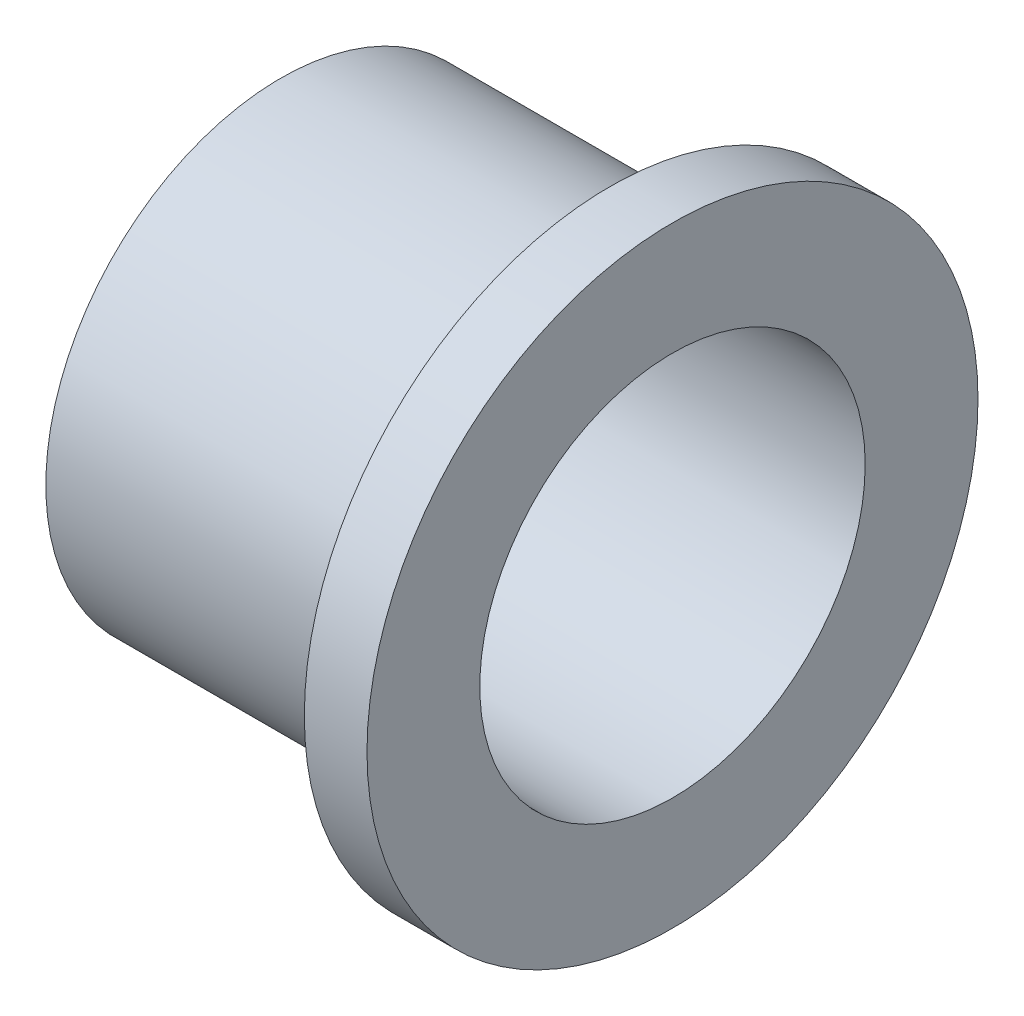
ISO-10303-21;
HEADER;
FILE_DESCRIPTION(('STEP AP214'),'2;1');
FILE_NAME('part.step','',(''),(''),'','','');
FILE_SCHEMA(('AUTOMOTIVE_DESIGN { 1 0 10303 214 1 1 1 1 }'));
ENDSEC;
DATA;
#1=APPLICATION_CONTEXT('core data for automotive mechanical design processes');
#2=APPLICATION_PROTOCOL_DEFINITION('international standard','automotive_design',2000,#1);
#3=PRODUCT_CONTEXT('',#1,'mechanical');
#4=PRODUCT('Part','Part','',(#3));
#5=PRODUCT_RELATED_PRODUCT_CATEGORY('part','',(#4));
#6=PRODUCT_DEFINITION_FORMATION('','',#4);
#7=PRODUCT_DEFINITION_CONTEXT('part definition',#1,'design');
#8=PRODUCT_DEFINITION('design','',#6,#7);
#9=PRODUCT_DEFINITION_SHAPE('','',#8);
#10=(LENGTH_UNIT() NAMED_UNIT(*) SI_UNIT(.MILLI.,.METRE.));
#11=(NAMED_UNIT(*) PLANE_ANGLE_UNIT() SI_UNIT($,.RADIAN.));
#12=(NAMED_UNIT(*) SI_UNIT($,.STERADIAN.) SOLID_ANGLE_UNIT());
#13=UNCERTAINTY_MEASURE_WITH_UNIT(LENGTH_MEASURE(1.E-05),#10,'distance_accuracy_value','');
#14=(GEOMETRIC_REPRESENTATION_CONTEXT(3) GLOBAL_UNCERTAINTY_ASSIGNED_CONTEXT((#13)) GLOBAL_UNIT_ASSIGNED_CONTEXT((#10,
#11,#12)) REPRESENTATION_CONTEXT('',''));
#15=CARTESIAN_POINT('',(0.,0.,0.));
#16=DIRECTION('',(0.,0.,1.));
#17=DIRECTION('',(1.,0.,0.));
#18=AXIS2_PLACEMENT_3D('',#15,#16,#17);
#19=CARTESIAN_POINT('',(5.,0.,0.));
#20=DIRECTION('',(-1.,0.,0.));
#21=DIRECTION('',(0.,0.,1.));
#22=AXIS2_PLACEMENT_3D('',#19,#20,#21);
#23=CYLINDRICAL_SURFACE('',#22,3.);
#24=CARTESIAN_POINT('',(0.,0.,0.));
#25=DIRECTION('',(1.,0.,0.));
#26=DIRECTION('',(0.,0.,-1.));
#27=AXIS2_PLACEMENT_3D('',#24,#25,#26);
#28=CIRCLE('',#27,3.);
#29=CARTESIAN_POINT('',(0.,0.,-3.));
#30=VERTEX_POINT('',#29);
#31=EDGE_CURVE('E33',#30,#30,#28,.T.);
#32=ORIENTED_EDGE('',*,*,#31,.T.);
#33=EDGE_LOOP('',(#32));
#34=FACE_BOUND('',#33,.T.);
#35=CARTESIAN_POINT('',(4.2,0.,0.));
#36=DIRECTION('',(1.,0.,0.));
#37=DIRECTION('',(0.,0.,-1.));
#38=AXIS2_PLACEMENT_3D('',#35,#36,#37);
#39=CIRCLE('',#38,3.);
#40=CARTESIAN_POINT('',(4.2,0.,-3.));
#41=VERTEX_POINT('',#40);
#42=EDGE_CURVE('E10',#41,#41,#39,.T.);
#43=ORIENTED_EDGE('',*,*,#42,.F.);
#44=EDGE_LOOP('',(#43));
#45=FACE_BOUND('',#44,.T.);
#46=ADVANCED_FACE('F30',(#34,#45),#23,.T.);
#47=CARTESIAN_POINT('',(5.,0.,0.));
#48=DIRECTION('',(1.,0.,0.));
#49=DIRECTION('',(0.,0.,-1.));
#50=AXIS2_PLACEMENT_3D('',#47,#48,#49);
#51=PLANE('',#50);
#52=CARTESIAN_POINT('',(5.,0.,0.));
#53=DIRECTION('',(1.,0.,0.));
#54=DIRECTION('',(0.,0.,-1.));
#55=AXIS2_PLACEMENT_3D('',#52,#53,#54);
#56=CIRCLE('',#55,2.46);
#57=CARTESIAN_POINT('',(5.,0.,-2.46));
#58=VERTEX_POINT('',#57);
#59=EDGE_CURVE('E41',#58,#58,#56,.T.);
#60=ORIENTED_EDGE('',*,*,#59,.F.);
#61=EDGE_LOOP('',(#60));
#62=FACE_BOUND('',#61,.T.);
#63=CARTESIAN_POINT('',(5.,0.,0.));
#64=DIRECTION('',(1.,0.,0.));
#65=DIRECTION('',(0.,0.,-1.));
#66=AXIS2_PLACEMENT_3D('',#63,#64,#65);
#67=CIRCLE('',#66,3.9);
#68=CARTESIAN_POINT('',(5.,0.,-3.9));
#69=VERTEX_POINT('',#68);
#70=EDGE_CURVE('E44',#69,#69,#67,.T.);
#71=ORIENTED_EDGE('',*,*,#70,.T.);
#72=EDGE_LOOP('',(#71));
#73=FACE_BOUND('',#72,.T.);
#74=ADVANCED_FACE('F58',(#62,#73),#51,.T.);
#75=CARTESIAN_POINT('',(0.,0.,0.));
#76=DIRECTION('',(1.,0.,0.));
#77=DIRECTION('',(0.,0.,-1.));
#78=AXIS2_PLACEMENT_3D('',#75,#76,#77);
#79=PLANE('',#78);
#80=ORIENTED_EDGE('',*,*,#31,.F.);
#81=EDGE_LOOP('',(#80));
#82=FACE_BOUND('',#81,.T.);
#83=CARTESIAN_POINT('',(0.,0.,0.));
#84=DIRECTION('',(1.,0.,0.));
#85=DIRECTION('',(0.,0.,-1.));
#86=AXIS2_PLACEMENT_3D('',#83,#84,#85);
#87=CIRCLE('',#86,2.46);
#88=CARTESIAN_POINT('',(0.,0.,-2.46));
#89=VERTEX_POINT('',#88);
#90=EDGE_CURVE('E47',#89,#89,#87,.T.);
#91=ORIENTED_EDGE('',*,*,#90,.T.);
#92=EDGE_LOOP('',(#91));
#93=FACE_BOUND('',#92,.T.);
#94=ADVANCED_FACE('F76',(#82,#93),#79,.F.);
#95=CARTESIAN_POINT('',(5.,0.,0.));
#96=DIRECTION('',(-1.,0.,0.));
#97=DIRECTION('',(0.,0.,1.));
#98=AXIS2_PLACEMENT_3D('',#95,#96,#97);
#99=CYLINDRICAL_SURFACE('',#98,2.46);
#100=ORIENTED_EDGE('',*,*,#59,.T.);
#101=EDGE_LOOP('',(#100));
#102=FACE_BOUND('',#101,.T.);
#103=ORIENTED_EDGE('',*,*,#90,.F.);
#104=EDGE_LOOP('',(#103));
#105=FACE_BOUND('',#104,.T.);
#106=ADVANCED_FACE('F67',(#102,#105),#99,.F.);
#107=CARTESIAN_POINT('',(4.2,0.,0.));
#108=DIRECTION('',(1.,0.,0.));
#109=DIRECTION('',(0.,0.,-1.));
#110=AXIS2_PLACEMENT_3D('',#107,#108,#109);
#111=PLANE('',#110);
#112=CARTESIAN_POINT('',(4.2,0.,0.));
#113=DIRECTION('',(1.,0.,0.));
#114=DIRECTION('',(0.,0.,-1.));
#115=AXIS2_PLACEMENT_3D('',#112,#113,#114);
#116=CIRCLE('',#115,3.9);
#117=CARTESIAN_POINT('',(4.2,0.,-3.9));
#118=VERTEX_POINT('',#117);
#119=EDGE_CURVE('E49',#118,#118,#116,.T.);
#120=ORIENTED_EDGE('',*,*,#119,.F.);
#121=EDGE_LOOP('',(#120));
#122=FACE_BOUND('',#121,.T.);
#123=ORIENTED_EDGE('',*,*,#42,.T.);
#124=EDGE_LOOP('',(#123));
#125=FACE_BOUND('',#124,.T.);
#126=ADVANCED_FACE('F62',(#122,#125),#111,.F.);
#127=CARTESIAN_POINT('',(4.2,0.,0.));
#128=DIRECTION('',(1.,0.,0.));
#129=DIRECTION('',(0.,0.,-1.));
#130=AXIS2_PLACEMENT_3D('',#127,#128,#129);
#131=CYLINDRICAL_SURFACE('',#130,3.9);
#132=ORIENTED_EDGE('',*,*,#119,.T.);
#133=EDGE_LOOP('',(#132));
#134=FACE_BOUND('',#133,.T.);
#135=ORIENTED_EDGE('',*,*,#70,.F.);
#136=EDGE_LOOP('',(#135));
#137=FACE_BOUND('',#136,.T.);
#138=ADVANCED_FACE('F60',(#134,#137),#131,.T.);
#139=CLOSED_SHELL('',(#46,#74,#94,#106,#126,#138));
#140=MANIFOLD_SOLID_BREP('B2',#139);
#141=ADVANCED_BREP_SHAPE_REPRESENTATION('',(#18,#140),#14);
#142=SHAPE_DEFINITION_REPRESENTATION(#9,#141);
ENDSEC;
END-ISO-10303-21;
